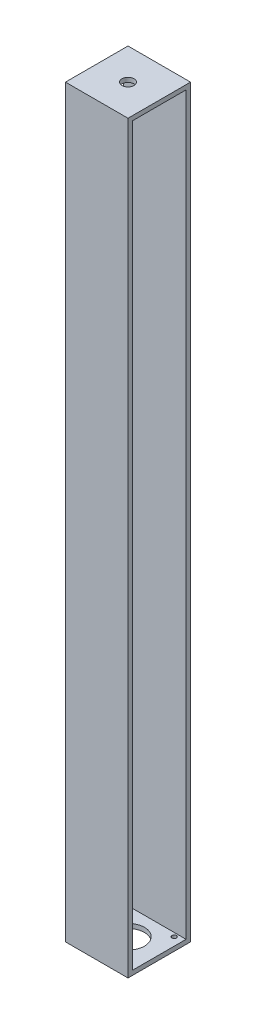
ISO-10303-21;
HEADER;
FILE_DESCRIPTION(('STEP AP214'),'2;1');
FILE_NAME('part.step','',(''),(''),'','','');
FILE_SCHEMA(('AUTOMOTIVE_DESIGN { 1 0 10303 214 1 1 1 1 }'));
ENDSEC;
DATA;
#1=APPLICATION_CONTEXT('core data for automotive mechanical design processes');
#2=APPLICATION_PROTOCOL_DEFINITION('international standard','automotive_design',2000,#1);
#3=PRODUCT_CONTEXT('',#1,'mechanical');
#4=PRODUCT('Part','Part','',(#3));
#5=PRODUCT_RELATED_PRODUCT_CATEGORY('part','',(#4));
#6=PRODUCT_DEFINITION_FORMATION('','',#4);
#7=PRODUCT_DEFINITION_CONTEXT('part definition',#1,'design');
#8=PRODUCT_DEFINITION('design','',#6,#7);
#9=PRODUCT_DEFINITION_SHAPE('','',#8);
#10=(LENGTH_UNIT() NAMED_UNIT(*) SI_UNIT(.MILLI.,.METRE.));
#11=(NAMED_UNIT(*) PLANE_ANGLE_UNIT() SI_UNIT($,.RADIAN.));
#12=(NAMED_UNIT(*) SI_UNIT($,.STERADIAN.) SOLID_ANGLE_UNIT());
#13=UNCERTAINTY_MEASURE_WITH_UNIT(LENGTH_MEASURE(1.E-05),#10,'distance_accuracy_value','');
#14=(GEOMETRIC_REPRESENTATION_CONTEXT(3) GLOBAL_UNCERTAINTY_ASSIGNED_CONTEXT((#13)) GLOBAL_UNIT_ASSIGNED_CONTEXT((#10,
#11,#12)) REPRESENTATION_CONTEXT('',''));
#15=CARTESIAN_POINT('',(0.,0.,0.));
#16=DIRECTION('',(0.,0.,1.));
#17=DIRECTION('',(1.,0.,0.));
#18=AXIS2_PLACEMENT_3D('',#15,#16,#17);
#19=CARTESIAN_POINT('',(0.,500.,0.));
#20=DIRECTION('',(1.,0.,0.));
#21=DIRECTION('',(0.,0.,-1.));
#22=AXIS2_PLACEMENT_3D('',#19,#20,#21);
#23=PLANE('',#22);
#24=DIRECTION('',(0.,0.,1.));
#25=VECTOR('',#24,1.);
#26=CARTESIAN_POINT('',(0.,0.,0.));
#27=LINE('',#26,#25);
#28=CARTESIAN_POINT('',(0.,0.,0.));
#29=VERTEX_POINT('',#28);
#30=CARTESIAN_POINT('',(0.,0.,42.));
#31=VERTEX_POINT('',#30);
#32=EDGE_CURVE('E170',#29,#31,#27,.T.);
#33=ORIENTED_EDGE('',*,*,#32,.T.);
#34=DIRECTION('',(0.,-1.,0.));
#35=VECTOR('',#34,1.);
#36=CARTESIAN_POINT('',(0.,500.,42.));
#37=LINE('',#36,#35);
#38=CARTESIAN_POINT('',(0.,500.,42.));
#39=VERTEX_POINT('',#38);
#40=EDGE_CURVE('E11',#39,#31,#37,.T.);
#41=ORIENTED_EDGE('',*,*,#40,.F.);
#42=DIRECTION('',(0.,0.,1.));
#43=VECTOR('',#42,1.);
#44=CARTESIAN_POINT('',(0.,500.,0.));
#45=LINE('',#44,#43);
#46=CARTESIAN_POINT('',(0.,500.,0.));
#47=VERTEX_POINT('',#46);
#48=EDGE_CURVE('E171',#47,#39,#45,.T.);
#49=ORIENTED_EDGE('',*,*,#48,.F.);
#50=DIRECTION('',(0.,-1.,0.));
#51=VECTOR('',#50,1.);
#52=CARTESIAN_POINT('',(0.,500.,0.));
#53=LINE('',#52,#51);
#54=EDGE_CURVE('E181',#47,#29,#53,.T.);
#55=ORIENTED_EDGE('',*,*,#54,.T.);
#56=EDGE_LOOP('',(#33,#41,#49,#55));
#57=FACE_BOUND('',#56,.T.);
#58=DIRECTION('',(0.,-1.,0.));
#59=VECTOR('',#58,1.);
#60=CARTESIAN_POINT('',(0.,497.,39.));
#61=LINE('',#60,#59);
#62=CARTESIAN_POINT('',(0.,497.,39.));
#63=VERTEX_POINT('',#62);
#64=CARTESIAN_POINT('',(0.,3.,39.));
#65=VERTEX_POINT('',#64);
#66=EDGE_CURVE('E47',#63,#65,#61,.T.);
#67=ORIENTED_EDGE('',*,*,#66,.T.);
#68=DIRECTION('',(0.,0.,-1.));
#69=VECTOR('',#68,1.);
#70=CARTESIAN_POINT('',(0.,3.,39.));
#71=LINE('',#70,#69);
#72=CARTESIAN_POINT('',(0.,3.,2.99999999999996));
#73=VERTEX_POINT('',#72);
#74=EDGE_CURVE('E113',#65,#73,#71,.T.);
#75=ORIENTED_EDGE('',*,*,#74,.T.);
#76=DIRECTION('',(0.,1.,0.));
#77=VECTOR('',#76,1.);
#78=CARTESIAN_POINT('',(0.,497.,3.));
#79=LINE('',#78,#77);
#80=CARTESIAN_POINT('',(0.,497.,3.));
#81=VERTEX_POINT('',#80);
#82=EDGE_CURVE('E127',#73,#81,#79,.T.);
#83=ORIENTED_EDGE('',*,*,#82,.T.);
#84=DIRECTION('',(0.,0.,1.));
#85=VECTOR('',#84,1.);
#86=CARTESIAN_POINT('',(0.,497.,39.));
#87=LINE('',#86,#85);
#88=EDGE_CURVE('E106',#81,#63,#87,.T.);
#89=ORIENTED_EDGE('',*,*,#88,.T.);
#90=EDGE_LOOP('',(#67,#75,#83,#89));
#91=FACE_BOUND('',#90,.T.);
#92=ADVANCED_FACE('F33',(#57,#91),#23,.F.);
#93=CARTESIAN_POINT('',(42.,500.,0.));
#94=DIRECTION('',(-1.,0.,0.));
#95=DIRECTION('',(0.,0.,1.));
#96=AXIS2_PLACEMENT_3D('',#93,#94,#95);
#97=PLANE('',#96);
#98=DIRECTION('',(0.,0.,-1.));
#99=VECTOR('',#98,1.);
#100=CARTESIAN_POINT('',(42.,0.,0.));
#101=LINE('',#100,#99);
#102=CARTESIAN_POINT('',(42.,0.,42.));
#103=VERTEX_POINT('',#102);
#104=CARTESIAN_POINT('',(42.,0.,0.));
#105=VERTEX_POINT('',#104);
#106=EDGE_CURVE('E186',#103,#105,#101,.T.);
#107=ORIENTED_EDGE('',*,*,#106,.T.);
#108=DIRECTION('',(0.,-1.,0.));
#109=VECTOR('',#108,1.);
#110=CARTESIAN_POINT('',(42.,500.,0.));
#111=LINE('',#110,#109);
#112=CARTESIAN_POINT('',(42.,500.,0.));
#113=VERTEX_POINT('',#112);
#114=EDGE_CURVE('E191',#113,#105,#111,.T.);
#115=ORIENTED_EDGE('',*,*,#114,.F.);
#116=DIRECTION('',(0.,0.,-1.));
#117=VECTOR('',#116,1.);
#118=CARTESIAN_POINT('',(42.,500.,0.));
#119=LINE('',#118,#117);
#120=CARTESIAN_POINT('',(42.,500.,42.));
#121=VERTEX_POINT('',#120);
#122=EDGE_CURVE('E177',#121,#113,#119,.T.);
#123=ORIENTED_EDGE('',*,*,#122,.F.);
#124=DIRECTION('',(0.,-1.,0.));
#125=VECTOR('',#124,1.);
#126=CARTESIAN_POINT('',(42.,500.,42.));
#127=LINE('',#126,#125);
#128=EDGE_CURVE('E40',#121,#103,#127,.T.);
#129=ORIENTED_EDGE('',*,*,#128,.T.);
#130=EDGE_LOOP('',(#107,#115,#123,#129));
#131=FACE_BOUND('',#130,.T.);
#132=DIRECTION('',(0.,-1.,0.));
#133=VECTOR('',#132,1.);
#134=CARTESIAN_POINT('',(42.,497.,39.));
#135=LINE('',#134,#133);
#136=CARTESIAN_POINT('',(42.,497.,39.));
#137=VERTEX_POINT('',#136);
#138=CARTESIAN_POINT('',(42.,3.,39.));
#139=VERTEX_POINT('',#138);
#140=EDGE_CURVE('E97',#137,#139,#135,.T.);
#141=ORIENTED_EDGE('',*,*,#140,.F.);
#142=DIRECTION('',(0.,0.,1.));
#143=VECTOR('',#142,1.);
#144=CARTESIAN_POINT('',(42.,497.,39.));
#145=LINE('',#144,#143);
#146=CARTESIAN_POINT('',(42.,497.,3.));
#147=VERTEX_POINT('',#146);
#148=EDGE_CURVE('E121',#147,#137,#145,.T.);
#149=ORIENTED_EDGE('',*,*,#148,.F.);
#150=DIRECTION('',(0.,1.,0.));
#151=VECTOR('',#150,1.);
#152=CARTESIAN_POINT('',(42.,497.,3.));
#153=LINE('',#152,#151);
#154=CARTESIAN_POINT('',(42.,3.,2.99999999999996));
#155=VERTEX_POINT('',#154);
#156=EDGE_CURVE('E119',#155,#147,#153,.T.);
#157=ORIENTED_EDGE('',*,*,#156,.F.);
#158=DIRECTION('',(0.,0.,-1.));
#159=VECTOR('',#158,1.);
#160=CARTESIAN_POINT('',(42.,3.,39.));
#161=LINE('',#160,#159);
#162=EDGE_CURVE('E105',#139,#155,#161,.T.);
#163=ORIENTED_EDGE('',*,*,#162,.F.);
#164=EDGE_LOOP('',(#141,#149,#157,#163));
#165=FACE_BOUND('',#164,.T.);
#166=ADVANCED_FACE('F118',(#131,#165),#97,.F.);
#167=CARTESIAN_POINT('',(0.,500.,42.));
#168=DIRECTION('',(0.,0.,-1.));
#169=DIRECTION('',(-1.,0.,0.));
#170=AXIS2_PLACEMENT_3D('',#167,#168,#169);
#171=PLANE('',#170);
#172=DIRECTION('',(1.,0.,0.));
#173=VECTOR('',#172,1.);
#174=CARTESIAN_POINT('',(0.,0.,42.));
#175=LINE('',#174,#173);
#176=EDGE_CURVE('E184',#31,#103,#175,.T.);
#177=ORIENTED_EDGE('',*,*,#176,.T.);
#178=ORIENTED_EDGE('',*,*,#128,.F.);
#179=DIRECTION('',(1.,0.,0.));
#180=VECTOR('',#179,1.);
#181=CARTESIAN_POINT('',(0.,500.,42.));
#182=LINE('',#181,#180);
#183=EDGE_CURVE('E174',#39,#121,#182,.T.);
#184=ORIENTED_EDGE('',*,*,#183,.F.);
#185=ORIENTED_EDGE('',*,*,#40,.T.);
#186=EDGE_LOOP('',(#177,#178,#184,#185));
#187=FACE_BOUND('',#186,.T.);
#188=ADVANCED_FACE('F214',(#187),#171,.F.);
#189=CARTESIAN_POINT('',(0.,500.,0.));
#190=DIRECTION('',(0.,0.,1.));
#191=DIRECTION('',(1.,0.,0.));
#192=AXIS2_PLACEMENT_3D('',#189,#190,#191);
#193=PLANE('',#192);
#194=DIRECTION('',(-1.,0.,0.));
#195=VECTOR('',#194,1.);
#196=CARTESIAN_POINT('',(0.,0.,0.));
#197=LINE('',#196,#195);
#198=EDGE_CURVE('E175',#105,#29,#197,.T.);
#199=ORIENTED_EDGE('',*,*,#198,.T.);
#200=ORIENTED_EDGE('',*,*,#54,.F.);
#201=DIRECTION('',(-1.,0.,0.));
#202=VECTOR('',#201,1.);
#203=CARTESIAN_POINT('',(0.,500.,0.));
#204=LINE('',#203,#202);
#205=EDGE_CURVE('E179',#113,#47,#204,.T.);
#206=ORIENTED_EDGE('',*,*,#205,.F.);
#207=ORIENTED_EDGE('',*,*,#114,.T.);
#208=EDGE_LOOP('',(#199,#200,#206,#207));
#209=FACE_BOUND('',#208,.T.);
#210=ADVANCED_FACE('F206',(#209),#193,.F.);
#211=CARTESIAN_POINT('',(0.,500.,0.));
#212=DIRECTION('',(0.,1.,0.));
#213=DIRECTION('',(0.,0.,1.));
#214=AXIS2_PLACEMENT_3D('',#211,#212,#213);
#215=PLANE('',#214);
#216=CARTESIAN_POINT('',(21.,500.,21.));
#217=DIRECTION('',(0.,1.,0.));
#218=DIRECTION('',(0.,0.,1.));
#219=AXIS2_PLACEMENT_3D('',#216,#217,#218);
#220=CIRCLE('',#219,4.);
#221=CARTESIAN_POINT('',(21.,500.,25.));
#222=VERTEX_POINT('',#221);
#223=EDGE_CURVE('E152',#222,#222,#220,.T.);
#224=ORIENTED_EDGE('',*,*,#223,.F.);
#225=EDGE_LOOP('',(#224));
#226=FACE_BOUND('',#225,.T.);
#227=ORIENTED_EDGE('',*,*,#48,.T.);
#228=ORIENTED_EDGE('',*,*,#183,.T.);
#229=ORIENTED_EDGE('',*,*,#122,.T.);
#230=ORIENTED_EDGE('',*,*,#205,.T.);
#231=EDGE_LOOP('',(#227,#228,#229,#230));
#232=FACE_BOUND('',#231,.T.);
#233=ADVANCED_FACE('F213',(#226,#232),#215,.T.);
#234=CARTESIAN_POINT('',(0.,0.,0.));
#235=DIRECTION('',(0.,1.,0.));
#236=DIRECTION('',(0.,0.,1.));
#237=AXIS2_PLACEMENT_3D('',#234,#235,#236);
#238=PLANE('',#237);
#239=CARTESIAN_POINT('',(36.5,0.,36.5));
#240=DIRECTION('',(0.,-1.,0.));
#241=DIRECTION('',(0.,0.,-1.));
#242=AXIS2_PLACEMENT_3D('',#239,#240,#241);
#243=CIRCLE('',#242,1.5);
#244=CARTESIAN_POINT('',(36.5,0.,35.));
#245=VERTEX_POINT('',#244);
#246=EDGE_CURVE('E155',#245,#245,#243,.T.);
#247=ORIENTED_EDGE('',*,*,#246,.F.);
#248=EDGE_LOOP('',(#247));
#249=FACE_BOUND('',#248,.T.);
#250=CARTESIAN_POINT('',(36.5,0.,5.50000000000003));
#251=DIRECTION('',(0.,-1.,0.));
#252=DIRECTION('',(0.,0.,1.));
#253=AXIS2_PLACEMENT_3D('',#250,#251,#252);
#254=CIRCLE('',#253,1.5);
#255=CARTESIAN_POINT('',(36.5,0.,7.00000000000002));
#256=VERTEX_POINT('',#255);
#257=EDGE_CURVE('E158',#256,#256,#254,.T.);
#258=ORIENTED_EDGE('',*,*,#257,.F.);
#259=EDGE_LOOP('',(#258));
#260=FACE_BOUND('',#259,.T.);
#261=CARTESIAN_POINT('',(5.49999999999999,0.,36.5));
#262=DIRECTION('',(0.,-1.,0.));
#263=DIRECTION('',(0.,0.,1.));
#264=AXIS2_PLACEMENT_3D('',#261,#262,#263);
#265=CIRCLE('',#264,1.5);
#266=CARTESIAN_POINT('',(5.49999999999999,0.,38.));
#267=VERTEX_POINT('',#266);
#268=EDGE_CURVE('E161',#267,#267,#265,.T.);
#269=ORIENTED_EDGE('',*,*,#268,.F.);
#270=EDGE_LOOP('',(#269));
#271=FACE_BOUND('',#270,.T.);
#272=CARTESIAN_POINT('',(5.5,0.,5.5));
#273=DIRECTION('',(0.,-1.,0.));
#274=DIRECTION('',(0.,0.,-1.));
#275=AXIS2_PLACEMENT_3D('',#272,#273,#274);
#276=CIRCLE('',#275,1.5);
#277=CARTESIAN_POINT('',(5.5,0.,4.));
#278=VERTEX_POINT('',#277);
#279=EDGE_CURVE('E164',#278,#278,#276,.T.);
#280=ORIENTED_EDGE('',*,*,#279,.F.);
#281=EDGE_LOOP('',(#280));
#282=FACE_BOUND('',#281,.T.);
#283=CARTESIAN_POINT('',(21.,0.,21.));
#284=DIRECTION('',(0.,-1.,0.));
#285=DIRECTION('',(0.,0.,-1.));
#286=AXIS2_PLACEMENT_3D('',#283,#284,#285);
#287=CIRCLE('',#286,11.);
#288=CARTESIAN_POINT('',(21.,0.,10.));
#289=VERTEX_POINT('',#288);
#290=EDGE_CURVE('E167',#289,#289,#287,.T.);
#291=ORIENTED_EDGE('',*,*,#290,.F.);
#292=EDGE_LOOP('',(#291));
#293=FACE_BOUND('',#292,.T.);
#294=ORIENTED_EDGE('',*,*,#32,.F.);
#295=ORIENTED_EDGE('',*,*,#198,.F.);
#296=ORIENTED_EDGE('',*,*,#106,.F.);
#297=ORIENTED_EDGE('',*,*,#176,.F.);
#298=EDGE_LOOP('',(#294,#295,#296,#297));
#299=FACE_BOUND('',#298,.T.);
#300=ADVANCED_FACE('F203',(#249,#260,#271,#282,#293,#299),#238,.F.);
#301=CARTESIAN_POINT('',(21.,3.,21.));
#302=DIRECTION('',(0.,-1.,0.));
#303=DIRECTION('',(0.,0.,-1.));
#304=AXIS2_PLACEMENT_3D('',#301,#302,#303);
#305=CYLINDRICAL_SURFACE('',#304,11.);
#306=CARTESIAN_POINT('',(21.,3.,21.));
#307=DIRECTION('',(0.,1.,0.));
#308=DIRECTION('',(0.,0.,1.));
#309=AXIS2_PLACEMENT_3D('',#306,#307,#308);
#310=CIRCLE('',#309,11.);
#311=CARTESIAN_POINT('',(21.,3.,32.));
#312=VERTEX_POINT('',#311);
#313=EDGE_CURVE('E149',#312,#312,#310,.F.);
#314=ORIENTED_EDGE('',*,*,#313,.F.);
#315=EDGE_LOOP('',(#314));
#316=FACE_BOUND('',#315,.T.);
#317=ORIENTED_EDGE('',*,*,#290,.T.);
#318=EDGE_LOOP('',(#317));
#319=FACE_BOUND('',#318,.T.);
#320=ADVANCED_FACE('F292',(#316,#319),#305,.F.);
#321=CARTESIAN_POINT('',(5.5,3.,5.5));
#322=DIRECTION('',(0.,-1.,0.));
#323=DIRECTION('',(0.,0.,-1.));
#324=AXIS2_PLACEMENT_3D('',#321,#322,#323);
#325=CYLINDRICAL_SURFACE('',#324,1.5);
#326=CARTESIAN_POINT('',(5.5,3.,5.5));
#327=DIRECTION('',(0.,1.,0.));
#328=DIRECTION('',(0.,0.,1.));
#329=AXIS2_PLACEMENT_3D('',#326,#327,#328);
#330=CIRCLE('',#329,1.5);
#331=CARTESIAN_POINT('',(5.5,3.,7.));
#332=VERTEX_POINT('',#331);
#333=EDGE_CURVE('E146',#332,#332,#330,.F.);
#334=ORIENTED_EDGE('',*,*,#333,.F.);
#335=EDGE_LOOP('',(#334));
#336=FACE_BOUND('',#335,.T.);
#337=ORIENTED_EDGE('',*,*,#279,.T.);
#338=EDGE_LOOP('',(#337));
#339=FACE_BOUND('',#338,.T.);
#340=ADVANCED_FACE('F288',(#336,#339),#325,.F.);
#341=CARTESIAN_POINT('',(5.49999999999999,3.,36.5));
#342=DIRECTION('',(0.,-1.,0.));
#343=DIRECTION('',(0.,0.,-1.));
#344=AXIS2_PLACEMENT_3D('',#341,#342,#343);
#345=CYLINDRICAL_SURFACE('',#344,1.5);
#346=CARTESIAN_POINT('',(5.49999999999999,3.,36.5));
#347=DIRECTION('',(0.,1.,0.));
#348=DIRECTION('',(0.,0.,1.));
#349=AXIS2_PLACEMENT_3D('',#346,#347,#348);
#350=CIRCLE('',#349,1.5);
#351=CARTESIAN_POINT('',(5.49999999999999,3.,38.));
#352=VERTEX_POINT('',#351);
#353=EDGE_CURVE('E143',#352,#352,#350,.F.);
#354=ORIENTED_EDGE('',*,*,#353,.F.);
#355=EDGE_LOOP('',(#354));
#356=FACE_BOUND('',#355,.T.);
#357=ORIENTED_EDGE('',*,*,#268,.T.);
#358=EDGE_LOOP('',(#357));
#359=FACE_BOUND('',#358,.T.);
#360=ADVANCED_FACE('F284',(#356,#359),#345,.F.);
#361=CARTESIAN_POINT('',(36.5,3.,5.50000000000003));
#362=DIRECTION('',(0.,-1.,0.));
#363=DIRECTION('',(0.,0.,-1.));
#364=AXIS2_PLACEMENT_3D('',#361,#362,#363);
#365=CYLINDRICAL_SURFACE('',#364,1.5);
#366=CARTESIAN_POINT('',(36.5,3.,5.50000000000003));
#367=DIRECTION('',(0.,1.,0.));
#368=DIRECTION('',(0.,0.,1.));
#369=AXIS2_PLACEMENT_3D('',#366,#367,#368);
#370=CIRCLE('',#369,1.5);
#371=CARTESIAN_POINT('',(36.5,3.,7.00000000000002));
#372=VERTEX_POINT('',#371);
#373=EDGE_CURVE('E140',#372,#372,#370,.F.);
#374=ORIENTED_EDGE('',*,*,#373,.F.);
#375=EDGE_LOOP('',(#374));
#376=FACE_BOUND('',#375,.T.);
#377=ORIENTED_EDGE('',*,*,#257,.T.);
#378=EDGE_LOOP('',(#377));
#379=FACE_BOUND('',#378,.T.);
#380=ADVANCED_FACE('F280',(#376,#379),#365,.F.);
#381=CARTESIAN_POINT('',(36.5,3.,36.5));
#382=DIRECTION('',(0.,-1.,0.));
#383=DIRECTION('',(0.,0.,-1.));
#384=AXIS2_PLACEMENT_3D('',#381,#382,#383);
#385=CYLINDRICAL_SURFACE('',#384,1.5);
#386=CARTESIAN_POINT('',(36.5,3.,36.5));
#387=DIRECTION('',(0.,1.,0.));
#388=DIRECTION('',(0.,0.,1.));
#389=AXIS2_PLACEMENT_3D('',#386,#387,#388);
#390=CIRCLE('',#389,1.5);
#391=CARTESIAN_POINT('',(36.5,3.,38.));
#392=VERTEX_POINT('',#391);
#393=EDGE_CURVE('E137',#392,#392,#390,.F.);
#394=ORIENTED_EDGE('',*,*,#393,.F.);
#395=EDGE_LOOP('',(#394));
#396=FACE_BOUND('',#395,.T.);
#397=ORIENTED_EDGE('',*,*,#246,.T.);
#398=EDGE_LOOP('',(#397));
#399=FACE_BOUND('',#398,.T.);
#400=ADVANCED_FACE('F276',(#396,#399),#385,.F.);
#401=CARTESIAN_POINT('',(21.,497.,21.));
#402=DIRECTION('',(0.,1.,0.));
#403=DIRECTION('',(0.,0.,1.));
#404=AXIS2_PLACEMENT_3D('',#401,#402,#403);
#405=CYLINDRICAL_SURFACE('',#404,4.);
#406=CARTESIAN_POINT('',(21.,497.,21.));
#407=DIRECTION('',(0.,-1.,0.));
#408=DIRECTION('',(0.,0.,-1.));
#409=AXIS2_PLACEMENT_3D('',#406,#407,#408);
#410=CIRCLE('',#409,4.);
#411=CARTESIAN_POINT('',(21.,497.,17.));
#412=VERTEX_POINT('',#411);
#413=EDGE_CURVE('E114',#412,#412,#410,.F.);
#414=ORIENTED_EDGE('',*,*,#413,.F.);
#415=EDGE_LOOP('',(#414));
#416=FACE_BOUND('',#415,.T.);
#417=ORIENTED_EDGE('',*,*,#223,.T.);
#418=EDGE_LOOP('',(#417));
#419=FACE_BOUND('',#418,.T.);
#420=ADVANCED_FACE('F241',(#416,#419),#405,.F.);
#421=CARTESIAN_POINT('',(42.,3.,39.));
#422=DIRECTION('',(0.,1.,0.));
#423=DIRECTION('',(0.,0.,1.));
#424=AXIS2_PLACEMENT_3D('',#421,#422,#423);
#425=PLANE('',#424);
#426=ORIENTED_EDGE('',*,*,#333,.T.);
#427=EDGE_LOOP('',(#426));
#428=FACE_BOUND('',#427,.T.);
#429=ORIENTED_EDGE('',*,*,#373,.T.);
#430=EDGE_LOOP('',(#429));
#431=FACE_BOUND('',#430,.T.);
#432=ORIENTED_EDGE('',*,*,#74,.F.);
#433=DIRECTION('',(-1.,0.,0.));
#434=VECTOR('',#433,1.);
#435=CARTESIAN_POINT('',(42.,3.,39.));
#436=LINE('',#435,#434);
#437=EDGE_CURVE('E100',#139,#65,#436,.T.);
#438=ORIENTED_EDGE('',*,*,#437,.F.);
#439=ORIENTED_EDGE('',*,*,#162,.T.);
#440=DIRECTION('',(-1.,0.,0.));
#441=VECTOR('',#440,1.);
#442=CARTESIAN_POINT('',(42.,3.,2.99999999999996));
#443=LINE('',#442,#441);
#444=EDGE_CURVE('E115',#155,#73,#443,.T.);
#445=ORIENTED_EDGE('',*,*,#444,.T.);
#446=EDGE_LOOP('',(#432,#438,#439,#445));
#447=FACE_BOUND('',#446,.T.);
#448=ORIENTED_EDGE('',*,*,#393,.T.);
#449=EDGE_LOOP('',(#448));
#450=FACE_BOUND('',#449,.T.);
#451=ORIENTED_EDGE('',*,*,#353,.T.);
#452=EDGE_LOOP('',(#451));
#453=FACE_BOUND('',#452,.T.);
#454=ORIENTED_EDGE('',*,*,#313,.T.);
#455=EDGE_LOOP('',(#454));
#456=FACE_BOUND('',#455,.T.);
#457=ADVANCED_FACE('F109',(#428,#431,#447,#450,#453,#456),#425,.T.);
#458=CARTESIAN_POINT('',(42.,497.,39.));
#459=DIRECTION('',(0.,-1.,0.));
#460=DIRECTION('',(0.,0.,-1.));
#461=AXIS2_PLACEMENT_3D('',#458,#459,#460);
#462=PLANE('',#461);
#463=ORIENTED_EDGE('',*,*,#88,.F.);
#464=DIRECTION('',(-1.,0.,0.));
#465=VECTOR('',#464,1.);
#466=CARTESIAN_POINT('',(42.,497.,3.));
#467=LINE('',#466,#465);
#468=EDGE_CURVE('E55',#147,#81,#467,.T.);
#469=ORIENTED_EDGE('',*,*,#468,.F.);
#470=ORIENTED_EDGE('',*,*,#148,.T.);
#471=DIRECTION('',(-1.,0.,0.));
#472=VECTOR('',#471,1.);
#473=CARTESIAN_POINT('',(42.,497.,39.));
#474=LINE('',#473,#472);
#475=EDGE_CURVE('E101',#137,#63,#474,.T.);
#476=ORIENTED_EDGE('',*,*,#475,.T.);
#477=EDGE_LOOP('',(#463,#469,#470,#476));
#478=FACE_BOUND('',#477,.T.);
#479=ORIENTED_EDGE('',*,*,#413,.T.);
#480=EDGE_LOOP('',(#479));
#481=FACE_BOUND('',#480,.T.);
#482=ADVANCED_FACE('F240',(#478,#481),#462,.T.);
#483=CARTESIAN_POINT('',(42.,497.,39.));
#484=DIRECTION('',(0.,0.,-1.));
#485=DIRECTION('',(0.,1.,0.));
#486=AXIS2_PLACEMENT_3D('',#483,#484,#485);
#487=PLANE('',#486);
#488=ORIENTED_EDGE('',*,*,#66,.F.);
#489=ORIENTED_EDGE('',*,*,#475,.F.);
#490=ORIENTED_EDGE('',*,*,#140,.T.);
#491=ORIENTED_EDGE('',*,*,#437,.T.);
#492=EDGE_LOOP('',(#488,#489,#490,#491));
#493=FACE_BOUND('',#492,.T.);
#494=ADVANCED_FACE('F99',(#493),#487,.T.);
#495=CARTESIAN_POINT('',(42.,497.,3.));
#496=DIRECTION('',(0.,0.,1.));
#497=DIRECTION('',(0.,-1.,0.));
#498=AXIS2_PLACEMENT_3D('',#495,#496,#497);
#499=PLANE('',#498);
#500=ORIENTED_EDGE('',*,*,#82,.F.);
#501=ORIENTED_EDGE('',*,*,#444,.F.);
#502=ORIENTED_EDGE('',*,*,#156,.T.);
#503=ORIENTED_EDGE('',*,*,#468,.T.);
#504=EDGE_LOOP('',(#500,#501,#502,#503));
#505=FACE_BOUND('',#504,.T.);
#506=ADVANCED_FACE('F260',(#505),#499,.T.);
#507=CLOSED_SHELL('',(#92,#166,#188,#210,#233,#300,#320,#340,#360,#380,#400,#420,#457,#482,#494,#506));
#508=MANIFOLD_SOLID_BREP('B2',#507);
#509=ADVANCED_BREP_SHAPE_REPRESENTATION('',(#18,#508),#14);
#510=SHAPE_DEFINITION_REPRESENTATION(#9,#509);
ENDSEC;
END-ISO-10303-21;
